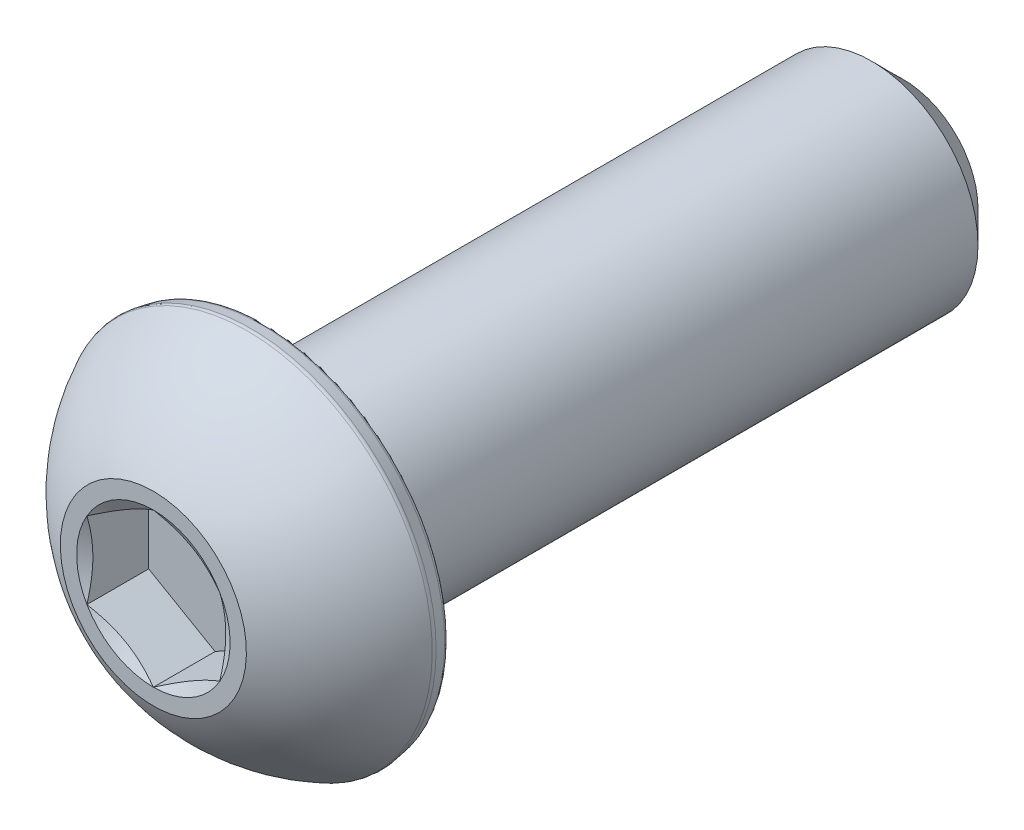
ISO-10303-21;
HEADER;
FILE_DESCRIPTION(('STEP AP214'),'2;1');
FILE_NAME('part.step','',(''),(''),'','','');
FILE_SCHEMA(('AUTOMOTIVE_DESIGN { 1 0 10303 214 1 1 1 1 }'));
ENDSEC;
DATA;
#1=APPLICATION_CONTEXT('core data for automotive mechanical design processes');
#2=APPLICATION_PROTOCOL_DEFINITION('international standard','automotive_design',2000,#1);
#3=PRODUCT_CONTEXT('',#1,'mechanical');
#4=PRODUCT('Part','Part','',(#3));
#5=PRODUCT_RELATED_PRODUCT_CATEGORY('part','',(#4));
#6=PRODUCT_DEFINITION_FORMATION('','',#4);
#7=PRODUCT_DEFINITION_CONTEXT('part definition',#1,'design');
#8=PRODUCT_DEFINITION('design','',#6,#7);
#9=PRODUCT_DEFINITION_SHAPE('','',#8);
#10=(LENGTH_UNIT() NAMED_UNIT(*) SI_UNIT(.MILLI.,.METRE.));
#11=(NAMED_UNIT(*) PLANE_ANGLE_UNIT() SI_UNIT($,.RADIAN.));
#12=(NAMED_UNIT(*) SI_UNIT($,.STERADIAN.) SOLID_ANGLE_UNIT());
#13=UNCERTAINTY_MEASURE_WITH_UNIT(LENGTH_MEASURE(1.E-05),#10,'distance_accuracy_value','');
#14=(GEOMETRIC_REPRESENTATION_CONTEXT(3) GLOBAL_UNCERTAINTY_ASSIGNED_CONTEXT((#13)) GLOBAL_UNIT_ASSIGNED_CONTEXT((#10,
#11,#12)) REPRESENTATION_CONTEXT('',''));
#15=CARTESIAN_POINT('',(0.,0.,0.));
#16=DIRECTION('',(0.,0.,1.));
#17=DIRECTION('',(1.,0.,0.));
#18=AXIS2_PLACEMENT_3D('',#15,#16,#17);
#19=CARTESIAN_POINT('',(0.,0.,11.2014));
#20=DIRECTION('',(0.,0.,-1.));
#21=DIRECTION('',(-1.,0.,0.));
#22=AXIS2_PLACEMENT_3D('',#19,#20,#21);
#23=PLANE('',#22);
#24=CARTESIAN_POINT('',(0.,0.,11.2014));
#25=DIRECTION('',(0.,0.,1.));
#26=DIRECTION('',(1.,0.,0.));
#27=AXIS2_PLACEMENT_3D('',#24,#25,#26);
#28=CIRCLE('',#27,2.29135888084633);
#29=CARTESIAN_POINT('',(-1.984375,1.14567944042316,11.2014));
#30=VERTEX_POINT('',#29);
#31=CARTESIAN_POINT('',(-1.984375,-1.14567944042316,11.2014));
#32=VERTEX_POINT('',#31);
#33=EDGE_CURVE('E89',#30,#32,#28,.T.);
#34=ORIENTED_EDGE('',*,*,#33,.F.);
#35=CARTESIAN_POINT('',(0.,2.29135888084633,11.2014));
#36=VERTEX_POINT('',#35);
#37=EDGE_CURVE('E98',#36,#30,#28,.T.);
#38=ORIENTED_EDGE('',*,*,#37,.F.);
#39=CARTESIAN_POINT('',(1.984375,1.14567944042316,11.2014));
#40=VERTEX_POINT('',#39);
#41=EDGE_CURVE('E49',#40,#36,#28,.T.);
#42=ORIENTED_EDGE('',*,*,#41,.F.);
#43=CARTESIAN_POINT('',(1.984375,-1.14567944042316,11.2014));
#44=VERTEX_POINT('',#43);
#45=EDGE_CURVE('E56',#44,#40,#28,.T.);
#46=ORIENTED_EDGE('',*,*,#45,.F.);
#47=CARTESIAN_POINT('',(0.,-2.29135888084633,11.2014));
#48=VERTEX_POINT('',#47);
#49=EDGE_CURVE('E131',#48,#44,#28,.T.);
#50=ORIENTED_EDGE('',*,*,#49,.F.);
#51=EDGE_CURVE('E99',#32,#48,#28,.T.);
#52=ORIENTED_EDGE('',*,*,#51,.F.);
#53=EDGE_LOOP('',(#34,#38,#42,#46,#50,#52));
#54=FACE_BOUND('',#53,.T.);
#55=CARTESIAN_POINT('',(0.,0.,11.2014));
#56=DIRECTION('',(0.,0.,1.));
#57=DIRECTION('',(1.,0.,0.));
#58=AXIS2_PLACEMENT_3D('',#55,#56,#57);
#59=CIRCLE('',#58,2.778125);
#60=CARTESIAN_POINT('',(0.,2.778125,11.2014));
#61=VERTEX_POINT('',#60);
#62=EDGE_CURVE('E110',#61,#61,#59,.T.);
#63=ORIENTED_EDGE('',*,*,#62,.T.);
#64=EDGE_LOOP('',(#63));
#65=FACE_BOUND('',#64,.T.);
#66=ADVANCED_FACE('F35',(#54,#65),#23,.F.);
#67=CARTESIAN_POINT('',(0.,0.,5.72656816343583));
#68=DIRECTION('',(0.,0.,1.));
#69=DIRECTION('',(0.,1.,0.));
#70=AXIS2_PLACEMENT_3D('',#67,#68,#69);
#71=SPHERICAL_SURFACE('',#70,6.13936170577053);
#72=CARTESIAN_POINT('',(0.,0.,8.40069876785227));
#73=DIRECTION('',(0.,0.,-1.));
#74=DIRECTION('',(-1.,0.,0.));
#75=AXIS2_PLACEMENT_3D('',#72,#73,#74);
#76=CIRCLE('',#75,5.52637201650459);
#77=CARTESIAN_POINT('',(0.,5.52637201650459,8.40069876785227));
#78=VERTEX_POINT('',#77);
#79=EDGE_CURVE('E109',#78,#78,#76,.F.);
#80=CARTESIAN_POINT('',(0.,5.52637201650459,8.40069876785227));
#81=CARTESIAN_POINT('',(0.,5.50825080177499,8.43814830718222));
#82=CARTESIAN_POINT('',(0.,5.48974881162674,8.47541359240028));
#83=CARTESIAN_POINT('',(0.,5.45199117255904,8.5495603788753));
#84=CARTESIAN_POINT('',(0.,5.4327355236396,8.58644188013227));
#85=CARTESIAN_POINT('',(0.,5.3934784590956,8.65980582294779));
#86=CARTESIAN_POINT('',(0.,5.37347704347106,8.69628826450634));
#87=CARTESIAN_POINT('',(0.,5.33273672924781,8.7688390196083));
#88=CARTESIAN_POINT('',(0.,5.3119978306491,8.80490733315171));
#89=CARTESIAN_POINT('',(0.,5.26979111662967,8.87661492366804));
#90=CARTESIAN_POINT('',(0.,5.24832330120893,8.91225420064095));
#91=CARTESIAN_POINT('',(0.,5.20466762693299,8.9830889898225));
#92=CARTESIAN_POINT('',(0.,5.18247976807778,9.01828450203114));
#93=CARTESIAN_POINT('',(0.,5.13739317629117,9.08821721606986));
#94=CARTESIAN_POINT('',(0.,5.11449444335976,9.12295441789994));
#95=CARTESIAN_POINT('',(0.,5.06799556699607,9.19195615519477));
#96=CARTESIAN_POINT('',(0.,5.04439542356379,9.22622069065952));
#97=CARTESIAN_POINT('',(0.,4.9965034795341,9.29426293451962));
#98=CARTESIAN_POINT('',(0.,4.9722116789367,9.32804064291497));
#99=CARTESIAN_POINT('',(0.,4.92294645978839,9.39509527314161));
#100=CARTESIAN_POINT('',(0.,4.89797304123748,9.4283721949729));
#101=CARTESIAN_POINT('',(0.,4.84735490708144,9.49441149953536));
#102=CARTESIAN_POINT('',(0.,4.82171019147632,9.52717388226652));
#103=CARTESIAN_POINT('',(0.,4.76976006154396,9.59217056874015));
#104=CARTESIAN_POINT('',(0.,4.74345464721672,9.62440487248262));
#105=CARTESIAN_POINT('',(0.,4.69019399122224,9.68833207933209));
#106=CARTESIAN_POINT('',(0.,4.66323874955498,9.72002498243909));
#107=CARTESIAN_POINT('',(0.,4.6086895788204,9.78285629011852));
#108=CARTESIAN_POINT('',(0.,4.58109564975306,9.81399469469096));
#109=CARTESIAN_POINT('',(0.,4.52528050811203,9.87570413656277));
#110=CARTESIAN_POINT('',(0.,4.49705929553834,9.90627517386215));
#111=CARTESIAN_POINT('',(0.,4.44000125001922,9.96683724692835));
#112=CARTESIAN_POINT('',(0.,4.41116441707379,9.99682828269518));
#113=CARTESIAN_POINT('',(0.,4.35288704836658,10.0562179581372));
#114=CARTESIAN_POINT('',(0.,4.32344651260481,10.0856165978123));
#115=CARTESIAN_POINT('',(0.,4.2639739053159,10.1438093313346));
#116=CARTESIAN_POINT('',(0.,4.23394183378876,10.1726034251818));
#117=CARTESIAN_POINT('',(0.,4.17329856648729,10.2295751671557));
#118=CARTESIAN_POINT('',(0.,4.14268737071296,10.2577528152824));
#119=CARTESIAN_POINT('',(0.,4.08089850577313,10.313480020685));
#120=CARTESIAN_POINT('',(0.,4.04972083660764,10.3410295779609));
#121=CARTESIAN_POINT('',(0.,3.98681190985103,10.3954892161058));
#122=CARTESIAN_POINT('',(0.,3.95508065225992,10.4223992969748));
#123=CARTESIAN_POINT('',(0.,3.89107766240224,10.47556886103));
#124=CARTESIAN_POINT('',(0.,3.85880593013567,10.5018283442161));
#125=CARTESIAN_POINT('',(0.,3.79373532804181,10.5536858605052));
#126=CARTESIAN_POINT('',(0.,3.76093645821454,10.5792838936082));
#127=CARTESIAN_POINT('',(0.,3.69482513596822,10.6298079306936));
#128=CARTESIAN_POINT('',(0.,3.66151268354918,10.654733934676));
#129=CARTESIAN_POINT('',(0.,3.59438796333499,10.7039036122083));
#130=CARTESIAN_POINT('',(0.,3.56057569553984,10.7281472857581));
#131=CARTESIAN_POINT('',(0.,3.49246531836684,10.7759422831338));
#132=CARTESIAN_POINT('',(0.,3.45816720898899,10.7994936069597));
#133=CARTESIAN_POINT('',(0.,3.3890993231695,10.8458941716134));
#134=CARTESIAN_POINT('',(0.,3.35432954672787,10.8687434124411));
#135=CARTESIAN_POINT('',(0.,3.28433269645534,10.913730368404));
#136=CARTESIAN_POINT('',(0.,3.24910562262445,10.9358680835392));
#137=CARTESIAN_POINT('',(0.,3.17820873538992,10.9794228378885));
#138=CARTESIAN_POINT('',(0.,3.14253892198628,11.0008398771027));
#139=CARTESIAN_POINT('',(0.,3.0707712995602,11.0429444331528));
#140=CARTESIAN_POINT('',(0.,3.03467349053775,11.0636319499888));
#141=CARTESIAN_POINT('',(0.,2.96206478589977,11.1042688941756));
#142=CARTESIAN_POINT('',(0.,2.92555389028423,11.1242183215265));
#143=CARTESIAN_POINT('',(0.,2.85213413627351,11.1633709073101));
#144=CARTESIAN_POINT('',(0.,2.81522527787832,11.1825740657429));
#145=CARTESIAN_POINT('',(0.,2.778125,11.2014));
#146=B_SPLINE_CURVE_WITH_KNOTS('',3,(#80,#81,#82,#83,#84,#85,#86,#87,#88,#89,#90,#91,#92,#93,
#94,#95,#96,#97,#98,#99,#100,#101,#102,#103,#104,#105,#106,#107,#108,#109,#110,#111,#112,#113,
#114,#115,#116,#117,#118,#119,#120,#121,#122,#123,#124,#125,#126,#127,#128,#129,#130,#131,#132,
#133,#134,#135,#136,#137,#138,#139,#140,#141,#142,#143,#144,#145),.UNSPECIFIED.,.F.,.F.,(4,2,2,
2,2,2,2,2,2,2,2,2,2,2,2,2,2,2,2,2,2,2,2,2,2,2,2,2,2,2,2,2,4),(0.,0.124808174209304,
0.249616348418609,0.374424522627913,0.499232696837217,0.624040871046521,0.748849045255827,
0.873657219465131,0.998465393674435,1.12327356788374,1.24808174209304,1.37288991630235,
1.49769809051165,1.62250626472096,1.74731443893026,1.87212261313957,1.99693078734887,
2.12173896155818,2.24654713576748,2.37135530997679,2.49616348418609,2.62097165839539,
2.7457798326047,2.870588006814,2.99539618102331,3.12020435523261,3.24501252944192,
3.36982070365122,3.49462887786053,3.61943705206983,3.74424522627914,3.86905340048844,
3.99386157469775),.UNSPECIFIED.);
#147=EDGE_CURVE('BSEAM204',#78,#61,#146,.T.);
#148=ORIENTED_EDGE('',*,*,#79,.T.);
#149=ORIENTED_EDGE('',*,*,#62,.F.);
#150=ORIENTED_EDGE('',*,*,#147,.T.);
#151=ORIENTED_EDGE('',*,*,#147,.F.);
#152=EDGE_LOOP('',(#148,#150,#149,#151));
#153=FACE_BOUND('',#152,.T.);
#154=ADVANCED_FACE('F204',(#153),#71,.T.);
#155=CARTESIAN_POINT('',(0.,0.,7.8486));
#156=DIRECTION('',(0.,0.,1.));
#157=DIRECTION('',(1.,0.,0.));
#158=AXIS2_PLACEMENT_3D('',#155,#156,#157);
#159=CONICAL_SURFACE('',#158,5.4612216348621,0.174532925199433);
#160=CARTESIAN_POINT('',(0.,0.,8.29856919154107));
#161=DIRECTION('',(0.,0.,-1.));
#162=DIRECTION('',(-1.,0.,0.));
#163=AXIS2_PLACEMENT_3D('',#160,#161,#162);
#164=CIRCLE('',#163,5.54056334381837);
#165=CARTESIAN_POINT('',(-5.54056334381837,0.,8.29856919154107));
#166=VERTEX_POINT('',#165);
#167=EDGE_CURVE('E43',#166,#166,#164,.T.);
#168=ORIENTED_EDGE('',*,*,#167,.T.);
#169=EDGE_LOOP('',(#168));
#170=FACE_BOUND('',#169,.T.);
#171=CARTESIAN_POINT('',(0.,0.,7.98712961949592));
#172=DIRECTION('',(0.,0.,-1.));
#173=DIRECTION('',(-1.,0.,0.));
#174=AXIS2_PLACEMENT_3D('',#171,#172,#173);
#175=CIRCLE('',#174,5.48564814440651);
#176=CARTESIAN_POINT('',(-5.48564814440651,0.,7.98712961949592));
#177=VERTEX_POINT('',#176);
#178=EDGE_CURVE('E229',#177,#177,#175,.F.);
#179=ORIENTED_EDGE('',*,*,#178,.T.);
#180=EDGE_LOOP('',(#179));
#181=FACE_BOUND('',#180,.T.);
#182=ADVANCED_FACE('F211',(#170,#181),#159,.T.);
#183=CARTESIAN_POINT('',(0.,5.4612216348621,7.8486));
#184=DIRECTION('',(0.,0.,1.));
#185=DIRECTION('',(1.,0.,0.));
#186=AXIS2_PLACEMENT_3D('',#183,#184,#185);
#187=PLANE('',#186);
#188=CARTESIAN_POINT('',(0.,0.,7.8486));
#189=DIRECTION('',(0.,0.,1.));
#190=DIRECTION('',(1.,0.,0.));
#191=AXIS2_PLACEMENT_3D('',#188,#189,#190);
#192=CIRCLE('',#191,5.32055497269154);
#193=CARTESIAN_POINT('',(5.32055497269154,0.,7.8486));
#194=VERTEX_POINT('',#193);
#195=EDGE_CURVE('E11',#194,#194,#192,.F.);
#196=ORIENTED_EDGE('',*,*,#195,.T.);
#197=EDGE_LOOP('',(#196));
#198=FACE_BOUND('',#197,.T.);
#199=CARTESIAN_POINT('',(0.,0.,7.8486));
#200=DIRECTION('',(0.,0.,1.));
#201=DIRECTION('',(1.,0.,0.));
#202=AXIS2_PLACEMENT_3D('',#199,#200,#201);
#203=CIRCLE('',#202,3.175);
#204=CARTESIAN_POINT('',(3.175,0.,7.8486));
#205=VERTEX_POINT('',#204);
#206=EDGE_CURVE('E292',#205,#205,#203,.T.);
#207=ORIENTED_EDGE('',*,*,#206,.T.);
#208=EDGE_LOOP('',(#207));
#209=FACE_BOUND('',#208,.T.);
#210=ADVANCED_FACE('F235',(#198,#209),#187,.F.);
#211=CARTESIAN_POINT('',(0.,0.,11.2014));
#212=DIRECTION('',(0.,0.,1.));
#213=DIRECTION('',(1.,0.,0.));
#214=AXIS2_PLACEMENT_3D('',#211,#212,#213);
#215=CYLINDRICAL_SURFACE('',#214,3.175);
#216=ORIENTED_EDGE('',*,*,#206,.F.);
#217=EDGE_LOOP('',(#216));
#218=FACE_BOUND('',#217,.T.);
#219=CARTESIAN_POINT('',(0.,0.,-10.2489));
#220=DIRECTION('',(0.,0.,1.));
#221=DIRECTION('',(1.,0.,0.));
#222=AXIS2_PLACEMENT_3D('',#219,#220,#221);
#223=CIRCLE('',#222,3.175);
#224=CARTESIAN_POINT('',(3.175,0.,-10.2489));
#225=VERTEX_POINT('',#224);
#226=EDGE_CURVE('E289',#225,#225,#223,.T.);
#227=ORIENTED_EDGE('',*,*,#226,.T.);
#228=EDGE_LOOP('',(#227));
#229=FACE_BOUND('',#228,.T.);
#230=ADVANCED_FACE('F240',(#218,#229),#215,.T.);
#231=CARTESIAN_POINT('',(0.,0.,-11.2014));
#232=DIRECTION('',(0.,0.,1.));
#233=DIRECTION('',(1.,0.,0.));
#234=AXIS2_PLACEMENT_3D('',#231,#232,#233);
#235=CONICAL_SURFACE('',#234,2.2225,0.785398163397442);
#236=ORIENTED_EDGE('',*,*,#226,.F.);
#237=EDGE_LOOP('',(#236));
#238=FACE_BOUND('',#237,.T.);
#239=CARTESIAN_POINT('',(0.,0.,-11.2014));
#240=DIRECTION('',(0.,0.,1.));
#241=DIRECTION('',(1.,0.,0.));
#242=AXIS2_PLACEMENT_3D('',#239,#240,#241);
#243=CIRCLE('',#242,2.2225);
#244=CARTESIAN_POINT('',(2.2225,0.,-11.2014));
#245=VERTEX_POINT('',#244);
#246=EDGE_CURVE('E277',#245,#245,#243,.T.);
#247=ORIENTED_EDGE('',*,*,#246,.T.);
#248=EDGE_LOOP('',(#247));
#249=FACE_BOUND('',#248,.T.);
#250=ADVANCED_FACE('F246',(#238,#249),#235,.T.);
#251=CARTESIAN_POINT('',(0.,0.,-11.2014));
#252=DIRECTION('',(0.,0.,1.));
#253=DIRECTION('',(1.,0.,0.));
#254=AXIS2_PLACEMENT_3D('',#251,#252,#253);
#255=PLANE('',#254);
#256=ORIENTED_EDGE('',*,*,#246,.F.);
#257=EDGE_LOOP('',(#256));
#258=FACE_BOUND('',#257,.T.);
#259=ADVANCED_FACE('F250',(#258),#255,.F.);
#260=CARTESIAN_POINT('',(0.,0.,11.2014));
#261=DIRECTION('',(0.,0.,1.));
#262=DIRECTION('',(1.,0.,0.));
#263=AXIS2_PLACEMENT_3D('',#260,#261,#262);
#264=CONICAL_SURFACE('',#263,2.29135888084633,1.0471975511966);
#265=ORIENTED_EDGE('',*,*,#51,.T.);
#266=CARTESIAN_POINT('',(-1.984575,-1.14556397036933,11.2014666717058));
#267=CARTESIAN_POINT('',(-1.89737036121932,-1.19591159204393,11.1723856822402));
#268=CARTESIAN_POINT('',(-1.809412980695,-1.24669380936686,11.1459372080271));
#269=CARTESIAN_POINT('',(-1.63197502132768,-1.34913766297205,11.0997702712065));
#270=CARTESIAN_POINT('',(-1.54249128874368,-1.40080112006751,11.080068142249));
#271=CARTESIAN_POINT('',(-1.36463285198753,-1.50348773640632,11.0493977319315));
#272=CARTESIAN_POINT('',(-1.27628551969391,-1.55449509248823,11.0382253427202));
#273=CARTESIAN_POINT('',(-1.09917497188905,-1.65674991493968,11.0248857960544));
#274=CARTESIAN_POINT('',(-1.01041240048945,-1.70799700943121,11.0227075944601));
#275=CARTESIAN_POINT('',(-0.844542697135338,-1.80376192731311,11.0272295515083));
#276=CARTESIAN_POINT('',(-0.767410784334093,-1.84829405793202,11.0328194134559));
#277=CARTESIAN_POINT('',(-0.613649492810919,-1.93706818098387,11.050538933897));
#278=CARTESIAN_POINT('',(-0.537020646254476,-1.98130986617092,11.0626746503295));
#279=CARTESIAN_POINT('',(-0.382942111493217,-2.07026714969167,11.0930141588444));
#280=CARTESIAN_POINT('',(-0.305511932787317,-2.11497148421093,11.111346609291));
#281=CARTESIAN_POINT('',(-0.151806688756412,-2.20371324822803,11.1529545064002));
#282=CARTESIAN_POINT('',(-0.0755296529470675,-2.24775181538554,11.1762201712824));
#283=CARTESIAN_POINT('',(0.000200000000000533,-2.29147435090016,11.2014666717058));
#284=B_SPLINE_CURVE_WITH_KNOTS('',3,(#266,#267,#268,#269,#270,#271,#272,#273,#274,#275,#276,
#277,#278,#279,#280,#281,#282,#283),.UNSPECIFIED.,.F.,.F.,(4,2,2,2,2,2,2,2,4),(0.,
0.314555137114086,0.629866549668807,0.937373439505933,1.24450262309398,1.51196650590478,
1.77967834211415,2.05332989762155,2.32644383656793),.UNSPECIFIED.);
#285=EDGE_CURVE('E104',#32,#48,#284,.T.);
#286=ORIENTED_EDGE('',*,*,#285,.F.);
#287=EDGE_LOOP('',(#265,#286));
#288=FACE_BOUND('',#287,.T.);
#289=ADVANCED_FACE('F105',(#288),#264,.F.);
#290=ORIENTED_EDGE('',*,*,#49,.T.);
#291=CARTESIAN_POINT('',(-0.000199999999999445,-2.29147435090017,11.2014666717058));
#292=CARTESIAN_POINT('',(0.0870046387806769,-2.24112672922556,11.1723856822402));
#293=CARTESIAN_POINT('',(0.174962019304997,-2.19034451190263,11.1459372080271));
#294=CARTESIAN_POINT('',(0.352399978672321,-2.08790065829744,11.0997702712065));
#295=CARTESIAN_POINT('',(0.44188371125632,-2.03623720120198,11.080068142249));
#296=CARTESIAN_POINT('',(0.619742148012469,-1.93355058486317,11.0493977319315));
#297=CARTESIAN_POINT('',(0.708089480306094,-1.88254322878126,11.0382253427202));
#298=CARTESIAN_POINT('',(0.88520002811095,-1.78028840632981,11.0248857960544));
#299=CARTESIAN_POINT('',(0.973962599510547,-1.72904131183829,11.0227075944601));
#300=CARTESIAN_POINT('',(1.13983230286466,-1.63327639395638,11.0272295515083));
#301=CARTESIAN_POINT('',(1.21696421566591,-1.58874426333747,11.0328194134559));
#302=CARTESIAN_POINT('',(1.37072550718908,-1.49997014028562,11.050538933897));
#303=CARTESIAN_POINT('',(1.44735435374552,-1.45572845509857,11.0626746503295));
#304=CARTESIAN_POINT('',(1.60143288850678,-1.36677117157782,11.0930141588444));
#305=CARTESIAN_POINT('',(1.67886306721268,-1.32206683705856,11.111346609291));
#306=CARTESIAN_POINT('',(1.83256831124359,-1.23332507304146,11.1529545064002));
#307=CARTESIAN_POINT('',(1.90884534705293,-1.18928650588395,11.1762201712824));
#308=CARTESIAN_POINT('',(1.984575,-1.14556397036933,11.2014666717058));
#309=B_SPLINE_CURVE_WITH_KNOTS('',3,(#291,#292,#293,#294,#295,#296,#297,#298,#299,#300,#301,
#302,#303,#304,#305,#306,#307,#308),.UNSPECIFIED.,.F.,.F.,(4,2,2,2,2,2,2,2,4),(0.,
0.314555137114086,0.629866549668807,0.937373439505933,1.24450262309398,1.51196650590478,
1.77967834211415,2.05332989762155,2.32644383656793),.UNSPECIFIED.);
#310=EDGE_CURVE('E133',#48,#44,#309,.T.);
#311=ORIENTED_EDGE('',*,*,#310,.F.);
#312=EDGE_LOOP('',(#290,#311));
#313=FACE_BOUND('',#312,.T.);
#314=ADVANCED_FACE('F318',(#313),#264,.F.);
#315=ORIENTED_EDGE('',*,*,#45,.T.);
#316=CARTESIAN_POINT('',(1.984375,-2.96692860034506,11.9392606510924));
#317=CARTESIAN_POINT('',(1.984375,-2.88123645369666,11.8981488017753));
#318=CARTESIAN_POINT('',(1.984375,-2.79533554929687,11.8574639729561));
#319=CARTESIAN_POINT('',(1.984375,-2.62300496253372,11.7771905979452));
#320=CARTESIAN_POINT('',(1.984375,-2.53657518838115,11.7376022490471));
#321=CARTESIAN_POINT('',(1.984375,-2.36258003650985,11.6595429144296));
#322=CARTESIAN_POINT('',(1.984375,-2.27501095051754,11.6210801633989));
#323=CARTESIAN_POINT('',(1.984375,-2.09913795632987,11.5458794270975));
#324=CARTESIAN_POINT('',(1.984375,-2.01083408662377,11.5091413521464));
#325=CARTESIAN_POINT('',(1.984375,-1.83102497893539,11.436913729355));
#326=CARTESIAN_POINT('',(1.984375,-1.73949640320228,11.4014819390739));
#327=CARTESIAN_POINT('',(1.984375,-1.55533214713673,11.3335641835568));
#328=CARTESIAN_POINT('',(1.984375,-1.46269633980311,11.3010785599926));
#329=CARTESIAN_POINT('',(1.984375,-1.27638419434465,11.2399821363592));
#330=CARTESIAN_POINT('',(1.984375,-1.18271082678456,11.2113623752382));
#331=CARTESIAN_POINT('',(1.984375,-0.994021652382585,11.1589763688606));
#332=CARTESIAN_POINT('',(1.984375,-0.89900618522973,11.1352089181985));
#333=CARTESIAN_POINT('',(1.984375,-0.707830512458419,11.0937947393806));
#334=CARTESIAN_POINT('',(1.984375,-0.611673084373237,11.076135440066));
#335=CARTESIAN_POINT('',(1.984375,-0.41828309211367,11.0480930965335));
#336=CARTESIAN_POINT('',(1.984375,-0.321050601045249,11.0377095606059));
#337=CARTESIAN_POINT('',(1.984375,-0.127210752774482,11.0251852009906));
#338=CARTESIAN_POINT('',(1.984375,-0.030609863978122,11.0229471073686));
#339=CARTESIAN_POINT('',(1.984375,0.162431915887107,11.0266420470322));
#340=CARTESIAN_POINT('',(1.984375,0.258872796678699,11.0325755862751));
#341=CARTESIAN_POINT('',(1.984375,0.496826477184735,11.0567755736915));
#342=CARTESIAN_POINT('',(1.984375,0.637878211825128,11.0795772202142));
#343=CARTESIAN_POINT('',(1.984375,0.917238703702528,11.1383760242614));
#344=CARTESIAN_POINT('',(1.984375,1.05554394232965,11.1743890855425));
#345=CARTESIAN_POINT('',(1.984375,1.26239464896717,11.2359082078903));
#346=CARTESIAN_POINT('',(1.984375,1.33200934564274,11.2579514264146));
#347=CARTESIAN_POINT('',(1.984375,1.47051409380588,11.3040769862575));
#348=CARTESIAN_POINT('',(1.984375,1.53940456776433,11.3281580550061));
#349=CARTESIAN_POINT('',(1.984375,1.67655293465251,11.3780095886895));
#350=CARTESIAN_POINT('',(1.984375,1.74481093998431,11.4037797466023));
#351=CARTESIAN_POINT('',(1.984375,1.88078910071683,11.4567307126816));
#352=CARTESIAN_POINT('',(1.984375,1.94850916300286,11.483911759183));
#353=CARTESIAN_POINT('',(1.984375,2.12136731788458,11.5550336238359));
#354=CARTESIAN_POINT('',(1.984375,2.22615977384557,11.5998135967013));
#355=CARTESIAN_POINT('',(1.984375,2.43479837304527,11.6915321956825));
#356=CARTESIAN_POINT('',(1.984375,2.5386444446916,11.7384709835113));
#357=CARTESIAN_POINT('',(1.984375,2.84907841644385,11.8817645613235));
#358=CARTESIAN_POINT('',(1.984375,3.05452739791262,11.9805818752643));
#359=CARTESIAN_POINT('',(1.984375,3.46367014223902,12.1823608857248));
#360=CARTESIAN_POINT('',(1.984375,3.66736143684958,12.285327527753));
#361=CARTESIAN_POINT('',(1.984375,4.0733484486621,12.4939084165548));
#362=CARTESIAN_POINT('',(1.984375,4.27564433912763,12.5995223267935));
#363=CARTESIAN_POINT('',(1.984375,4.66022184962415,12.8025193368616));
#364=CARTESIAN_POINT('',(1.984375,4.84259034249047,12.8997384272925));
#365=CARTESIAN_POINT('',(1.984375,5.20674070245669,13.0952843204883));
#366=CARTESIAN_POINT('',(1.984375,5.38852254752481,13.1936111642466));
#367=CARTESIAN_POINT('',(1.984375,5.75117247931181,13.390843617507));
#368=CARTESIAN_POINT('',(1.984375,5.93204171415673,13.4897471187779));
#369=CARTESIAN_POINT('',(1.984375,6.29341450955435,13.6881978398903));
#370=CARTESIAN_POINT('',(1.984375,6.47391808874828,13.7877450257738));
#371=CARTESIAN_POINT('',(1.984375,6.6542902961452,13.8875282522634));
#372=B_SPLINE_CURVE_WITH_KNOTS('',3,(#316,#317,#318,#319,#320,#321,#322,#323,#324,#325,#326,
#327,#328,#329,#330,#331,#332,#333,#334,#335,#336,#337,#338,#339,#340,#341,#342,#343,#344,#345,
#346,#347,#348,#349,#350,#351,#352,#353,#354,#355,#356,#357,#358,#359,#360,#361,#362,#363,#364,
#365,#366,#367,#368,#369,#370,#371),.UNSPECIFIED.,.F.,.F.,(4,2,2,2,2,2,2,2,2,2,2,2,2,2,2,2,2,2,
2,2,2,2,2,2,2,2,2,4),(0.,0.285135519832373,0.570322016122787,0.857238463819792,1.14413997577449,
1.43854271801315,1.7329795590899,2.02672173491208,2.32039085060263,2.61345191984504,
2.90649318156653,3.19602335108128,3.48557144803805,3.91334047285798,4.34162614021154,
4.56066589824458,4.77956986852721,4.99843415889189,5.21733554208811,5.55917796423187,
5.90104603503021,6.58489509249957,7.26958483186157,7.95418796687477,8.57417425374278,
9.1941835596094,9.81261585701217,10.431015790458),.UNSPECIFIED.);
#373=EDGE_CURVE('E142',#44,#40,#372,.T.);
#374=ORIENTED_EDGE('',*,*,#373,.F.);
#375=EDGE_LOOP('',(#315,#374));
#376=FACE_BOUND('',#375,.T.);
#377=ADVANCED_FACE('F314',(#376),#264,.F.);
#378=ORIENTED_EDGE('',*,*,#41,.T.);
#379=CARTESIAN_POINT('',(1.984575,1.14556397036933,11.2014666717058));
#380=CARTESIAN_POINT('',(1.89737036121932,1.19591159204393,11.1723856822402));
#381=CARTESIAN_POINT('',(1.809412980695,1.24669380936686,11.1459372080271));
#382=CARTESIAN_POINT('',(1.63197502132768,1.34913766297205,11.0997702712065));
#383=CARTESIAN_POINT('',(1.54249128874368,1.40080112006751,11.080068142249));
#384=CARTESIAN_POINT('',(1.36463285198753,1.50348773640632,11.0493977319315));
#385=CARTESIAN_POINT('',(1.27628551969391,1.55449509248823,11.0382253427202));
#386=CARTESIAN_POINT('',(1.09917497188905,1.65674991493969,11.0248857960544));
#387=CARTESIAN_POINT('',(1.01041240048945,1.70799700943121,11.0227075944601));
#388=CARTESIAN_POINT('',(0.844542697135338,1.80376192731311,11.0272295515083));
#389=CARTESIAN_POINT('',(0.767410784334093,1.84829405793202,11.0328194134559));
#390=CARTESIAN_POINT('',(0.613649492810919,1.93706818098387,11.050538933897));
#391=CARTESIAN_POINT('',(0.537020646254476,1.98130986617092,11.0626746503295));
#392=CARTESIAN_POINT('',(0.382942111493217,2.07026714969168,11.0930141588444));
#393=CARTESIAN_POINT('',(0.305511932787317,2.11497148421093,11.111346609291));
#394=CARTESIAN_POINT('',(0.151806688756411,2.20371324822803,11.1529545064002));
#395=CARTESIAN_POINT('',(0.0755296529470671,2.24775181538554,11.1762201712824));
#396=CARTESIAN_POINT('',(-0.000200000000000831,2.29147435090017,11.2014666717058));
#397=B_SPLINE_CURVE_WITH_KNOTS('',3,(#379,#380,#381,#382,#383,#384,#385,#386,#387,#388,#389,
#390,#391,#392,#393,#394,#395,#396),.UNSPECIFIED.,.F.,.F.,(4,2,2,2,2,2,2,2,4),(0.,
0.314555137114086,0.629866549668807,0.937373439505933,1.24450262309398,1.51196650590478,
1.77967834211415,2.05332989762155,2.32644383656793),.UNSPECIFIED.);
#398=EDGE_CURVE('E169',#40,#36,#397,.T.);
#399=ORIENTED_EDGE('',*,*,#398,.F.);
#400=EDGE_LOOP('',(#378,#399));
#401=FACE_BOUND('',#400,.T.);
#402=ADVANCED_FACE('F310',(#401),#264,.F.);
#403=ORIENTED_EDGE('',*,*,#37,.T.);
#404=CARTESIAN_POINT('',(0.000199999999999225,2.29147435090017,11.2014666717058));
#405=CARTESIAN_POINT('',(-0.0870046387806773,2.24112672922556,11.1723856822402));
#406=CARTESIAN_POINT('',(-0.174962019304997,2.19034451190263,11.1459372080271));
#407=CARTESIAN_POINT('',(-0.352399978672321,2.08790065829745,11.0997702712065));
#408=CARTESIAN_POINT('',(-0.44188371125632,2.03623720120198,11.080068142249));
#409=CARTESIAN_POINT('',(-0.619742148012469,1.93355058486317,11.0493977319315));
#410=CARTESIAN_POINT('',(-0.708089480306094,1.88254322878126,11.0382253427202));
#411=CARTESIAN_POINT('',(-0.885200028110951,1.78028840632981,11.0248857960544));
#412=CARTESIAN_POINT('',(-0.973962599510548,1.72904131183829,11.0227075944601));
#413=CARTESIAN_POINT('',(-1.13983230286466,1.63327639395638,11.0272295515083));
#414=CARTESIAN_POINT('',(-1.21696421566591,1.58874426333747,11.0328194134559));
#415=CARTESIAN_POINT('',(-1.37072550718908,1.49997014028563,11.050538933897));
#416=CARTESIAN_POINT('',(-1.44735435374553,1.45572845509857,11.0626746503295));
#417=CARTESIAN_POINT('',(-1.60143288850678,1.36677117157782,11.0930141588444));
#418=CARTESIAN_POINT('',(-1.67886306721268,1.32206683705856,11.111346609291));
#419=CARTESIAN_POINT('',(-1.83256831124359,1.23332507304146,11.1529545064002));
#420=CARTESIAN_POINT('',(-1.90884534705293,1.18928650588395,11.1762201712824));
#421=CARTESIAN_POINT('',(-1.984575,1.14556397036933,11.2014666717058));
#422=B_SPLINE_CURVE_WITH_KNOTS('',3,(#404,#405,#406,#407,#408,#409,#410,#411,#412,#413,#414,
#415,#416,#417,#418,#419,#420,#421),.UNSPECIFIED.,.F.,.F.,(4,2,2,2,2,2,2,2,4),(0.,
0.314555137114086,0.629866549668807,0.937373439505933,1.24450262309398,1.51196650590478,
1.77967834211415,2.05332989762155,2.32644383656793),.UNSPECIFIED.);
#423=EDGE_CURVE('E120',#36,#30,#422,.T.);
#424=ORIENTED_EDGE('',*,*,#423,.F.);
#425=EDGE_LOOP('',(#403,#424));
#426=FACE_BOUND('',#425,.T.);
#427=ADVANCED_FACE('F156',(#426),#264,.F.);
#428=ORIENTED_EDGE('',*,*,#33,.T.);
#429=CARTESIAN_POINT('',(-1.984375,-2.96692860034507,11.9392606510924));
#430=CARTESIAN_POINT('',(-1.984375,-2.88123645369667,11.8981488017753));
#431=CARTESIAN_POINT('',(-1.984375,-2.79533554929687,11.8574639729561));
#432=CARTESIAN_POINT('',(-1.984375,-2.62300496253372,11.7771905979452));
#433=CARTESIAN_POINT('',(-1.984375,-2.53657518838115,11.7376022490471));
#434=CARTESIAN_POINT('',(-1.984375,-2.36258003650985,11.6595429144296));
#435=CARTESIAN_POINT('',(-1.984375,-2.27501095051754,11.6210801633989));
#436=CARTESIAN_POINT('',(-1.984375,-2.09913795632987,11.5458794270975));
#437=CARTESIAN_POINT('',(-1.984375,-2.01083408662377,11.5091413521464));
#438=CARTESIAN_POINT('',(-1.984375,-1.83102497893539,11.436913729355));
#439=CARTESIAN_POINT('',(-1.984375,-1.73949640320228,11.4014819390739));
#440=CARTESIAN_POINT('',(-1.984375,-1.55533214713673,11.3335641835568));
#441=CARTESIAN_POINT('',(-1.984375,-1.46269633980311,11.3010785599926));
#442=CARTESIAN_POINT('',(-1.984375,-1.27638419434465,11.2399821363592));
#443=CARTESIAN_POINT('',(-1.984375,-1.18271082678456,11.2113623752382));
#444=CARTESIAN_POINT('',(-1.984375,-0.994021652382587,11.1589763688606));
#445=CARTESIAN_POINT('',(-1.984375,-0.899006185229732,11.1352089181985));
#446=CARTESIAN_POINT('',(-1.984375,-0.707830512458421,11.0937947393806));
#447=CARTESIAN_POINT('',(-1.984375,-0.61167308437324,11.076135440066));
#448=CARTESIAN_POINT('',(-1.984375,-0.418283092113672,11.0480930965335));
#449=CARTESIAN_POINT('',(-1.984375,-0.321050601045251,11.0377095606059));
#450=CARTESIAN_POINT('',(-1.984375,-0.127210752774483,11.0251852009906));
#451=CARTESIAN_POINT('',(-1.984375,-0.0306098639781238,11.0229471073686));
#452=CARTESIAN_POINT('',(-1.984375,0.162431915887106,11.0266420470322));
#453=CARTESIAN_POINT('',(-1.984375,0.258872796678698,11.0325755862751));
#454=CARTESIAN_POINT('',(-1.984375,0.496826477184734,11.0567755736915));
#455=CARTESIAN_POINT('',(-1.984375,0.637878211825128,11.0795772202142));
#456=CARTESIAN_POINT('',(-1.984375,0.917238703702529,11.1383760242614));
#457=CARTESIAN_POINT('',(-1.984375,1.05554394232965,11.1743890855425));
#458=CARTESIAN_POINT('',(-1.984375,1.26239464896717,11.2359082078903));
#459=CARTESIAN_POINT('',(-1.984375,1.33200934564274,11.2579514264146));
#460=CARTESIAN_POINT('',(-1.984375,1.47051409380588,11.3040769862575));
#461=CARTESIAN_POINT('',(-1.984375,1.53940456776433,11.3281580550061));
#462=CARTESIAN_POINT('',(-1.984375,1.67655293465251,11.3780095886895));
#463=CARTESIAN_POINT('',(-1.984375,1.74481093998431,11.4037797466023));
#464=CARTESIAN_POINT('',(-1.984375,1.88078910071683,11.4567307126816));
#465=CARTESIAN_POINT('',(-1.984375,1.94850916300286,11.483911759183));
#466=CARTESIAN_POINT('',(-1.984375,2.12136731788458,11.5550336238359));
#467=CARTESIAN_POINT('',(-1.984375,2.22615977384556,11.5998135967013));
#468=CARTESIAN_POINT('',(-1.984375,2.43479837304527,11.6915321956825));
#469=CARTESIAN_POINT('',(-1.984375,2.5386444446916,11.7384709835113));
#470=CARTESIAN_POINT('',(-1.984375,2.84907841644385,11.8817645613235));
#471=CARTESIAN_POINT('',(-1.984375,3.05452739791262,11.9805818752643));
#472=CARTESIAN_POINT('',(-1.984375,3.46367014223902,12.1823608857248));
#473=CARTESIAN_POINT('',(-1.984375,3.66736143684958,12.285327527753));
#474=CARTESIAN_POINT('',(-1.984375,4.07334844866211,12.4939084165548));
#475=CARTESIAN_POINT('',(-1.984375,4.27564433912763,12.5995223267935));
#476=CARTESIAN_POINT('',(-1.984375,4.66022184962415,12.8025193368616));
#477=CARTESIAN_POINT('',(-1.984375,4.84259034249047,12.8997384272925));
#478=CARTESIAN_POINT('',(-1.984375,5.20674070245669,13.0952843204883));
#479=CARTESIAN_POINT('',(-1.984375,5.38852254752481,13.1936111642466));
#480=CARTESIAN_POINT('',(-1.984375,5.7511724793118,13.390843617507));
#481=CARTESIAN_POINT('',(-1.984375,5.93204171415673,13.4897471187779));
#482=CARTESIAN_POINT('',(-1.984375,6.29341450955435,13.6881978398903));
#483=CARTESIAN_POINT('',(-1.984375,6.47391808874828,13.7877450257738));
#484=CARTESIAN_POINT('',(-1.984375,6.6542902961452,13.8875282522634));
#485=B_SPLINE_CURVE_WITH_KNOTS('',3,(#429,#430,#431,#432,#433,#434,#435,#436,#437,#438,#439,
#440,#441,#442,#443,#444,#445,#446,#447,#448,#449,#450,#451,#452,#453,#454,#455,#456,#457,#458,
#459,#460,#461,#462,#463,#464,#465,#466,#467,#468,#469,#470,#471,#472,#473,#474,#475,#476,#477,
#478,#479,#480,#481,#482,#483,#484),.UNSPECIFIED.,.F.,.F.,(4,2,2,2,2,2,2,2,2,2,2,2,2,2,2,2,2,2,
2,2,2,2,2,2,2,2,2,4),(0.,0.285135519832373,0.570322016122787,0.857238463819792,1.14413997577449,
1.43854271801315,1.7329795590899,2.02672173491208,2.32039085060263,2.61345191984504,
2.90649318156653,3.19602335108128,3.48557144803805,3.91334047285799,4.34162614021154,
4.56066589824458,4.77956986852721,4.99843415889189,5.21733554208812,5.55917796423187,
5.90104603503021,6.58489509249957,7.26958483186157,7.95418796687477,8.57417425374278,
9.1941835596094,9.81261585701217,10.431015790458),.UNSPECIFIED.);
#486=EDGE_CURVE('E93',#30,#32,#485,.F.);
#487=ORIENTED_EDGE('',*,*,#486,.F.);
#488=EDGE_LOOP('',(#428,#487));
#489=FACE_BOUND('',#488,.T.);
#490=ADVANCED_FACE('F91',(#489),#264,.F.);
#491=CARTESIAN_POINT('',(0.,0.,9.35736));
#492=DIRECTION('',(0.,0.,1.));
#493=DIRECTION('',(1.,0.,0.));
#494=AXIS2_PLACEMENT_3D('',#491,#492,#493);
#495=PLANE('',#494);
#496=DIRECTION('',(0.,-1.,0.));
#497=VECTOR('',#496,1.);
#498=CARTESIAN_POINT('',(-1.984375,1.14567944042316,9.35736));
#499=LINE('',#498,#497);
#500=CARTESIAN_POINT('',(-1.984375,1.14567944042316,9.35736));
#501=VERTEX_POINT('',#500);
#502=CARTESIAN_POINT('',(-1.984375,-1.14567944042316,9.35736));
#503=VERTEX_POINT('',#502);
#504=EDGE_CURVE('E119',#501,#503,#499,.T.);
#505=ORIENTED_EDGE('',*,*,#504,.T.);
#506=DIRECTION('',(0.866025403784439,-0.5,0.));
#507=VECTOR('',#506,1.);
#508=CARTESIAN_POINT('',(-1.984375,-1.14567944042316,9.35736));
#509=LINE('',#508,#507);
#510=CARTESIAN_POINT('',(0.,-2.29135888084633,9.35736));
#511=VERTEX_POINT('',#510);
#512=EDGE_CURVE('E124',#503,#511,#509,.T.);
#513=ORIENTED_EDGE('',*,*,#512,.T.);
#514=DIRECTION('',(0.866025403784438,0.5,0.));
#515=VECTOR('',#514,1.);
#516=CARTESIAN_POINT('',(0.,-2.29135888084633,9.35736));
#517=LINE('',#516,#515);
#518=CARTESIAN_POINT('',(1.984375,-1.14567944042316,9.35736));
#519=VERTEX_POINT('',#518);
#520=EDGE_CURVE('E266',#511,#519,#517,.T.);
#521=ORIENTED_EDGE('',*,*,#520,.T.);
#522=DIRECTION('',(0.,1.,0.));
#523=VECTOR('',#522,1.);
#524=CARTESIAN_POINT('',(1.984375,-1.14567944042316,9.35736));
#525=LINE('',#524,#523);
#526=CARTESIAN_POINT('',(1.984375,1.14567944042316,9.35736));
#527=VERTEX_POINT('',#526);
#528=EDGE_CURVE('E270',#519,#527,#525,.T.);
#529=ORIENTED_EDGE('',*,*,#528,.T.);
#530=DIRECTION('',(-0.866025403784439,0.5,0.));
#531=VECTOR('',#530,1.);
#532=CARTESIAN_POINT('',(1.984375,1.14567944042316,9.35736));
#533=LINE('',#532,#531);
#534=CARTESIAN_POINT('',(0.,2.29135888084633,9.35736));
#535=VERTEX_POINT('',#534);
#536=EDGE_CURVE('E273',#527,#535,#533,.T.);
#537=ORIENTED_EDGE('',*,*,#536,.T.);
#538=DIRECTION('',(-0.866025403784438,-0.5,0.));
#539=VECTOR('',#538,1.);
#540=CARTESIAN_POINT('',(0.,2.29135888084633,9.35736));
#541=LINE('',#540,#539);
#542=EDGE_CURVE('E127',#535,#501,#541,.T.);
#543=ORIENTED_EDGE('',*,*,#542,.T.);
#544=EDGE_LOOP('',(#505,#513,#521,#529,#537,#543));
#545=FACE_BOUND('',#544,.T.);
#546=ADVANCED_FACE('F155',(#545),#495,.T.);
#547=CARTESIAN_POINT('',(-1.984375,-1.14567944042316,9.35736));
#548=DIRECTION('',(-0.5,-0.866025403784439,0.));
#549=DIRECTION('',(0.866025403784439,-0.5,0.));
#550=AXIS2_PLACEMENT_3D('',#547,#548,#549);
#551=PLANE('',#550);
#552=DIRECTION('',(0.,0.,1.));
#553=VECTOR('',#552,1.);
#554=CARTESIAN_POINT('',(-1.984375,-1.14567944042316,9.35736));
#555=LINE('',#554,#553);
#556=EDGE_CURVE('E115',#503,#32,#555,.T.);
#557=ORIENTED_EDGE('',*,*,#556,.T.);
#558=ORIENTED_EDGE('',*,*,#285,.T.);
#559=DIRECTION('',(0.,0.,1.));
#560=VECTOR('',#559,1.);
#561=CARTESIAN_POINT('',(0.,-2.29135888084633,9.35736));
#562=LINE('',#561,#560);
#563=EDGE_CURVE('E126',#511,#48,#562,.T.);
#564=ORIENTED_EDGE('',*,*,#563,.F.);
#565=ORIENTED_EDGE('',*,*,#512,.F.);
#566=EDGE_LOOP('',(#557,#558,#564,#565));
#567=FACE_BOUND('',#566,.T.);
#568=ADVANCED_FACE('F122',(#567),#551,.F.);
#569=CARTESIAN_POINT('',(0.,-2.29135888084633,9.35736));
#570=DIRECTION('',(0.5,-0.866025403784439,0.));
#571=DIRECTION('',(0.866025403784439,0.5,0.));
#572=AXIS2_PLACEMENT_3D('',#569,#570,#571);
#573=PLANE('',#572);
#574=ORIENTED_EDGE('',*,*,#563,.T.);
#575=ORIENTED_EDGE('',*,*,#310,.T.);
#576=DIRECTION('',(0.,0.,1.));
#577=VECTOR('',#576,1.);
#578=CARTESIAN_POINT('',(1.984375,-1.14567944042316,9.35736));
#579=LINE('',#578,#577);
#580=EDGE_CURVE('E284',#519,#44,#579,.T.);
#581=ORIENTED_EDGE('',*,*,#580,.F.);
#582=ORIENTED_EDGE('',*,*,#520,.F.);
#583=EDGE_LOOP('',(#574,#575,#581,#582));
#584=FACE_BOUND('',#583,.T.);
#585=ADVANCED_FACE('F149',(#584),#573,.F.);
#586=CARTESIAN_POINT('',(1.984375,-1.14567944042316,9.35736));
#587=DIRECTION('',(1.,0.,0.));
#588=DIRECTION('',(0.,0.,-1.));
#589=AXIS2_PLACEMENT_3D('',#586,#587,#588);
#590=PLANE('',#589);
#591=ORIENTED_EDGE('',*,*,#580,.T.);
#592=ORIENTED_EDGE('',*,*,#373,.T.);
#593=DIRECTION('',(0.,0.,1.));
#594=VECTOR('',#593,1.);
#595=CARTESIAN_POINT('',(1.984375,1.14567944042316,9.35736));
#596=LINE('',#595,#594);
#597=EDGE_CURVE('E281',#527,#40,#596,.T.);
#598=ORIENTED_EDGE('',*,*,#597,.F.);
#599=ORIENTED_EDGE('',*,*,#528,.F.);
#600=EDGE_LOOP('',(#591,#592,#598,#599));
#601=FACE_BOUND('',#600,.T.);
#602=ADVANCED_FACE('F193',(#601),#590,.F.);
#603=CARTESIAN_POINT('',(1.984375,1.14567944042316,9.35736));
#604=DIRECTION('',(0.5,0.866025403784439,0.));
#605=DIRECTION('',(-0.866025403784439,0.5,0.));
#606=AXIS2_PLACEMENT_3D('',#603,#604,#605);
#607=PLANE('',#606);
#608=ORIENTED_EDGE('',*,*,#597,.T.);
#609=ORIENTED_EDGE('',*,*,#398,.T.);
#610=DIRECTION('',(0.,0.,1.));
#611=VECTOR('',#610,1.);
#612=CARTESIAN_POINT('',(0.,2.29135888084633,9.35736));
#613=LINE('',#612,#611);
#614=EDGE_CURVE('E278',#535,#36,#613,.T.);
#615=ORIENTED_EDGE('',*,*,#614,.F.);
#616=ORIENTED_EDGE('',*,*,#536,.F.);
#617=EDGE_LOOP('',(#608,#609,#615,#616));
#618=FACE_BOUND('',#617,.T.);
#619=ADVANCED_FACE('F189',(#618),#607,.F.);
#620=CARTESIAN_POINT('',(0.,2.29135888084633,9.35736));
#621=DIRECTION('',(-0.5,0.866025403784438,0.));
#622=DIRECTION('',(-0.866025403784439,-0.5,0.));
#623=AXIS2_PLACEMENT_3D('',#620,#621,#622);
#624=PLANE('',#623);
#625=ORIENTED_EDGE('',*,*,#614,.T.);
#626=ORIENTED_EDGE('',*,*,#423,.T.);
#627=DIRECTION('',(0.,0.,1.));
#628=VECTOR('',#627,1.);
#629=CARTESIAN_POINT('',(-1.984375,1.14567944042316,9.35736));
#630=LINE('',#629,#628);
#631=EDGE_CURVE('E117',#501,#30,#630,.T.);
#632=ORIENTED_EDGE('',*,*,#631,.F.);
#633=ORIENTED_EDGE('',*,*,#542,.F.);
#634=EDGE_LOOP('',(#625,#626,#632,#633));
#635=FACE_BOUND('',#634,.T.);
#636=ADVANCED_FACE('F186',(#635),#624,.F.);
#637=CARTESIAN_POINT('',(-1.984375,1.14567944042316,9.35736));
#638=DIRECTION('',(-1.,0.,0.));
#639=DIRECTION('',(0.,-1.,0.));
#640=AXIS2_PLACEMENT_3D('',#637,#638,#639);
#641=PLANE('',#640);
#642=ORIENTED_EDGE('',*,*,#631,.T.);
#643=ORIENTED_EDGE('',*,*,#486,.T.);
#644=ORIENTED_EDGE('',*,*,#556,.F.);
#645=ORIENTED_EDGE('',*,*,#504,.F.);
#646=EDGE_LOOP('',(#642,#643,#644,#645));
#647=FACE_BOUND('',#646,.T.);
#648=ADVANCED_FACE('F113',(#647),#641,.F.);
#649=CARTESIAN_POINT('',(0.,0.,8.32767957204515));
#650=DIRECTION('',(0.,0.,-1.));
#651=DIRECTION('',(-1.,0.,0.));
#652=AXIS2_PLACEMENT_3D('',#649,#650,#651);
#653=TOROIDAL_SURFACE('',#652,5.3754701721034,0.16764);
#654=ORIENTED_EDGE('',*,*,#167,.F.);
#655=EDGE_LOOP('',(#654));
#656=FACE_BOUND('',#655,.T.);
#657=ORIENTED_EDGE('',*,*,#79,.F.);
#658=EDGE_LOOP('',(#657));
#659=FACE_BOUND('',#658,.T.);
#660=ADVANCED_FACE('F215',(#656,#659),#653,.T.);
#661=CARTESIAN_POINT('',(0.,0.,8.01624));
#662=DIRECTION('',(0.,0.,1.));
#663=DIRECTION('',(1.,0.,0.));
#664=AXIS2_PLACEMENT_3D('',#661,#662,#663);
#665=TOROIDAL_SURFACE('',#664,5.32055497269154,0.16764);
#666=ORIENTED_EDGE('',*,*,#195,.F.);
#667=EDGE_LOOP('',(#666));
#668=FACE_BOUND('',#667,.T.);
#669=ORIENTED_EDGE('',*,*,#178,.F.);
#670=EDGE_LOOP('',(#669));
#671=FACE_BOUND('',#670,.T.);
#672=ADVANCED_FACE('F37',(#668,#671),#665,.T.);
#673=CLOSED_SHELL('',(#66,#154,#182,#210,#230,#250,#259,#289,#314,#377,#402,#427,#490,#546,#568,
#585,#602,#619,#636,#648,#660,#672));
#674=MANIFOLD_SOLID_BREP('B2',#673);
#675=ADVANCED_BREP_SHAPE_REPRESENTATION('',(#18,#674),#14);
#676=SHAPE_DEFINITION_REPRESENTATION(#9,#675);
ENDSEC;
END-ISO-10303-21;
